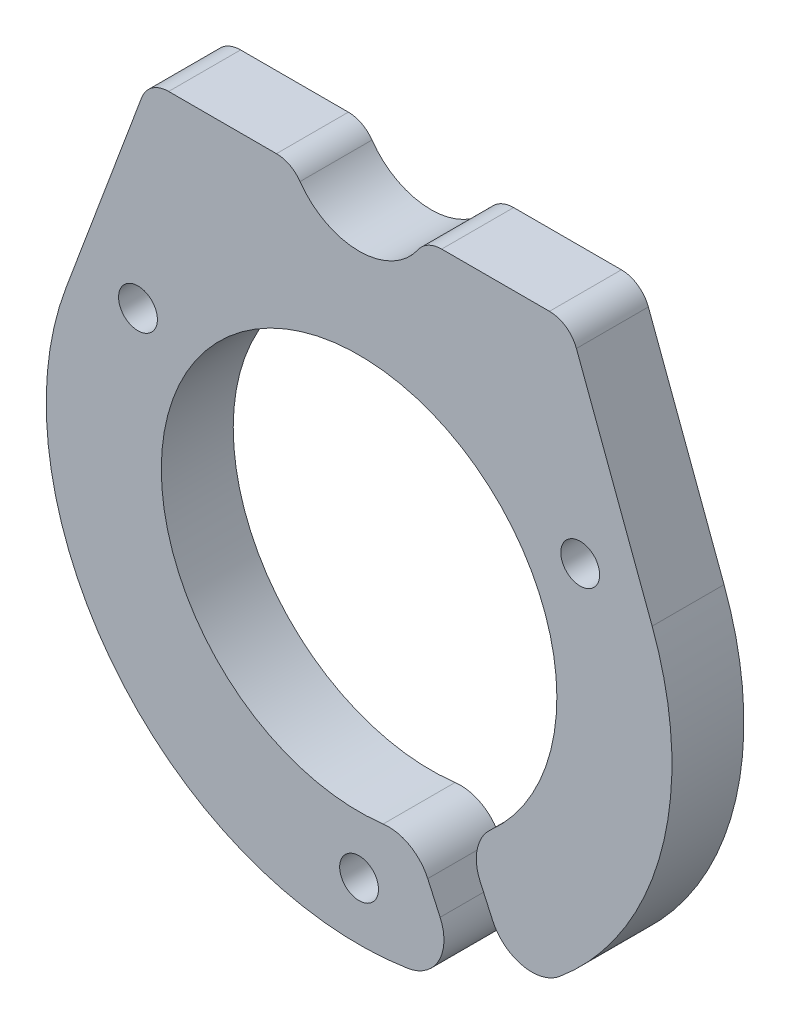
ISO-10303-21;
HEADER;
FILE_DESCRIPTION(('STEP AP214'),'2;1');
FILE_NAME('part.step','',(''),(''),'','','');
FILE_SCHEMA(('AUTOMOTIVE_DESIGN { 1 0 10303 214 1 1 1 1 }'));
ENDSEC;
DATA;
#1=APPLICATION_CONTEXT('core data for automotive mechanical design processes');
#2=APPLICATION_PROTOCOL_DEFINITION('international standard','automotive_design',2000,#1);
#3=PRODUCT_CONTEXT('',#1,'mechanical');
#4=PRODUCT('Part','Part','',(#3));
#5=PRODUCT_RELATED_PRODUCT_CATEGORY('part','',(#4));
#6=PRODUCT_DEFINITION_FORMATION('','',#4);
#7=PRODUCT_DEFINITION_CONTEXT('part definition',#1,'design');
#8=PRODUCT_DEFINITION('design','',#6,#7);
#9=PRODUCT_DEFINITION_SHAPE('','',#8);
#10=(LENGTH_UNIT() NAMED_UNIT(*) SI_UNIT(.MILLI.,.METRE.));
#11=(NAMED_UNIT(*) PLANE_ANGLE_UNIT() SI_UNIT($,.RADIAN.));
#12=(NAMED_UNIT(*) SI_UNIT($,.STERADIAN.) SOLID_ANGLE_UNIT());
#13=UNCERTAINTY_MEASURE_WITH_UNIT(LENGTH_MEASURE(1.E-05),#10,'distance_accuracy_value','');
#14=(GEOMETRIC_REPRESENTATION_CONTEXT(3) GLOBAL_UNCERTAINTY_ASSIGNED_CONTEXT((#13)) GLOBAL_UNIT_ASSIGNED_CONTEXT((#10,
#11,#12)) REPRESENTATION_CONTEXT('',''));
#15=CARTESIAN_POINT('',(0.,0.,0.));
#16=DIRECTION('',(0.,0.,1.));
#17=DIRECTION('',(1.,0.,0.));
#18=AXIS2_PLACEMENT_3D('',#15,#16,#17);
#19=CARTESIAN_POINT('',(0.,0.,4.99999999999997));
#20=DIRECTION('',(0.,0.,-1.));
#21=DIRECTION('',(-1.,0.,0.));
#22=AXIS2_PLACEMENT_3D('',#19,#20,#21);
#23=PLANE('',#22);
#24=DIRECTION('',(1.,0.,0.));
#25=VECTOR('',#24,1.);
#26=CARTESIAN_POINT('',(-21.7499999999999,23.,4.99999999999997));
#27=LINE('',#26,#25);
#28=CARTESIAN_POINT('',(5.74456264653802,23.,4.99999999999997));
#29=VERTEX_POINT('',#28);
#30=CARTESIAN_POINT('',(13.2372607145539,23.,4.99999999999997));
#31=VERTEX_POINT('',#30);
#32=EDGE_CURVE('E296',#29,#31,#27,.T.);
#33=ORIENTED_EDGE('',*,*,#32,.F.);
#34=CARTESIAN_POINT('',(5.74456264653803,21.,4.99999999999997));
#35=DIRECTION('',(0.,0.,-1.));
#36=DIRECTION('',(-1.,0.,0.));
#37=AXIS2_PLACEMENT_3D('',#34,#35,#36);
#38=CIRCLE('',#37,2.);
#39=CARTESIAN_POINT('',(4.10325903324145,22.1428571428571,4.99999999999997));
#40=VERTEX_POINT('',#39);
#41=EDGE_CURVE('E265',#29,#40,#38,.F.);
#42=ORIENTED_EDGE('',*,*,#41,.T.);
#43=CARTESIAN_POINT('',(0.,25.,4.99999999999997));
#44=DIRECTION('',(0.,0.,1.));
#45=DIRECTION('',(1.,0.,0.));
#46=AXIS2_PLACEMENT_3D('',#43,#44,#45);
#47=CIRCLE('',#46,5.);
#48=CARTESIAN_POINT('',(-4.10325903324145,22.1428571428571,4.99999999999997));
#49=VERTEX_POINT('',#48);
#50=EDGE_CURVE('E204',#49,#40,#47,.T.);
#51=ORIENTED_EDGE('',*,*,#50,.F.);
#52=CARTESIAN_POINT('',(-5.74456264653803,21.,4.99999999999997));
#53=DIRECTION('',(0.,0.,-1.));
#54=DIRECTION('',(-1.,0.,0.));
#55=AXIS2_PLACEMENT_3D('',#52,#53,#54);
#56=CIRCLE('',#55,2.);
#57=CARTESIAN_POINT('',(-5.74456264653803,23.,4.99999999999997));
#58=VERTEX_POINT('',#57);
#59=EDGE_CURVE('E263',#49,#58,#56,.F.);
#60=ORIENTED_EDGE('',*,*,#59,.T.);
#61=CARTESIAN_POINT('',(-13.2372607145539,23.,4.99999999999997));
#62=VERTEX_POINT('',#61);
#63=EDGE_CURVE('E286',#62,#58,#27,.T.);
#64=ORIENTED_EDGE('',*,*,#63,.F.);
#65=CARTESIAN_POINT('',(-13.2372607145539,21.,4.99999999999997));
#66=DIRECTION('',(0.,0.,-1.));
#67=DIRECTION('',(-1.,0.,0.));
#68=AXIS2_PLACEMENT_3D('',#65,#66,#67);
#69=CIRCLE('',#68,2.);
#70=CARTESIAN_POINT('',(-15.1107601140734,21.7,4.99999999999997));
#71=VERTEX_POINT('',#70);
#72=EDGE_CURVE('E259',#62,#71,#69,.F.);
#73=ORIENTED_EDGE('',*,*,#72,.T.);
#74=DIRECTION('',(-0.35,-0.93674969975976,0.));
#75=VECTOR('',#74,1.);
#76=CARTESIAN_POINT('',(-20.3743059697748,7.61249999999999,4.99999999999997));
#77=LINE('',#76,#75);
#78=CARTESIAN_POINT('',(-20.3743059697747,7.61249999999996,4.99999999999997));
#79=VERTEX_POINT('',#78);
#80=EDGE_CURVE('E189',#71,#79,#77,.T.);
#81=ORIENTED_EDGE('',*,*,#80,.T.);
#82=CARTESIAN_POINT('',(2.0122792321331E-13,0.,4.99999999999997));
#83=DIRECTION('',(0.,0.,1.));
#84=DIRECTION('',(1.,0.,0.));
#85=AXIS2_PLACEMENT_3D('',#82,#83,#84);
#86=CIRCLE('',#85,21.7500000000001);
#87=CARTESIAN_POINT('',(3.36438085449537,-21.4882163397968,4.99999999999997));
#88=VERTEX_POINT('',#87);
#89=EDGE_CURVE('E191',#79,#88,#86,.T.);
#90=ORIENTED_EDGE('',*,*,#89,.T.);
#91=CARTESIAN_POINT('',(2.90032832284087,-18.5243244308593,4.99999999999997));
#92=DIRECTION('',(0.,0.,-1.));
#93=DIRECTION('',(-1.,0.,0.));
#94=AXIS2_PLACEMENT_3D('',#91,#92,#93);
#95=CIRCLE('',#94,3.);
#96=CARTESIAN_POINT('',(5.63314686556143,-17.2867046134021,4.99999999999997));
#97=VERTEX_POINT('',#96);
#98=EDGE_CURVE('E235',#88,#97,#95,.F.);
#99=ORIENTED_EDGE('',*,*,#98,.T.);
#100=DIRECTION('',(-0.412539939152385,0.910939514240186,0.));
#101=VECTOR('',#100,1.);
#102=CARTESIAN_POINT('',(3.79021853689748,-13.2172895649055,4.99999999999997));
#103=LINE('',#102,#101);
#104=CARTESIAN_POINT('',(4.7731173916648,-15.3876525293947,4.99999999999997));
#105=VERTEX_POINT('',#104);
#106=EDGE_CURVE('E197',#97,#105,#103,.T.);
#107=ORIENTED_EDGE('',*,*,#106,.T.);
#108=CARTESIAN_POINT('',(2.04029884894424,-16.6252723468519,4.99999999999997));
#109=DIRECTION('',(0.,0.,-1.));
#110=DIRECTION('',(-1.,0.,0.));
#111=AXIS2_PLACEMENT_3D('',#108,#109,#110);
#112=CIRCLE('',#111,3.);
#113=CARTESIAN_POINT('',(1.67487218943184,-13.6476116280127,4.99999999999997));
#114=VERTEX_POINT('',#113);
#115=EDGE_CURVE('E239',#105,#114,#112,.F.);
#116=ORIENTED_EDGE('',*,*,#115,.T.);
#117=CARTESIAN_POINT('',(0.,0.,4.99999999999997));
#118=DIRECTION('',(0.,0.,-1.));
#119=DIRECTION('',(-1.,0.,0.));
#120=AXIS2_PLACEMENT_3D('',#117,#118,#119);
#121=CIRCLE('',#120,13.75);
#122=CARTESIAN_POINT('',(9.15273387349307,-10.2610897394484,4.99999999999997));
#123=VERTEX_POINT('',#122);
#124=EDGE_CURVE('E218',#114,#123,#121,.T.);
#125=ORIENTED_EDGE('',*,*,#124,.T.);
#126=CARTESIAN_POINT('',(11.1496939913461,-12.499872955328,4.99999999999997));
#127=DIRECTION('',(0.,0.,-1.));
#128=DIRECTION('',(-1.,0.,0.));
#129=AXIS2_PLACEMENT_3D('',#126,#127,#128);
#130=CIRCLE('',#129,3.);
#131=CARTESIAN_POINT('',(8.41687544862555,-13.7374927727852,4.99999999999997));
#132=VERTEX_POINT('',#131);
#133=EDGE_CURVE('E237',#123,#132,#130,.F.);
#134=ORIENTED_EDGE('',*,*,#133,.T.);
#135=DIRECTION('',(0.412539939152384,-0.910939514240186,0.));
#136=VECTOR('',#135,1.);
#137=CARTESIAN_POINT('',(7.43397659385823,-11.5671298082959,4.99999999999997));
#138=LINE('',#137,#136);
#139=CARTESIAN_POINT('',(9.27690492252214,-15.6365448567925,4.99999999999997));
#140=VERTEX_POINT('',#139);
#141=EDGE_CURVE('E173',#132,#140,#138,.T.);
#142=ORIENTED_EDGE('',*,*,#141,.T.);
#143=CARTESIAN_POINT('',(12.0097234652427,-14.3989250393354,4.99999999999997));
#144=DIRECTION('',(0.,0.,-1.));
#145=DIRECTION('',(-1.,0.,0.));
#146=AXIS2_PLACEMENT_3D('',#143,#144,#145);
#147=CIRCLE('',#146,3.);
#148=CARTESIAN_POINT('',(13.9312792196815,-16.702753045629,4.99999999999997));
#149=VERTEX_POINT('',#148);
#150=EDGE_CURVE('E169',#140,#149,#147,.F.);
#151=ORIENTED_EDGE('',*,*,#150,.T.);
#152=CARTESIAN_POINT('',(0.,0.,4.99999999999997));
#153=DIRECTION('',(0.,0.,1.));
#154=DIRECTION('',(1.,0.,0.));
#155=AXIS2_PLACEMENT_3D('',#152,#153,#154);
#156=CIRCLE('',#155,21.75);
#157=CARTESIAN_POINT('',(20.3743059697748,7.61249999999999,4.99999999999997));
#158=VERTEX_POINT('',#157);
#159=EDGE_CURVE('E161',#149,#158,#156,.T.);
#160=ORIENTED_EDGE('',*,*,#159,.T.);
#161=DIRECTION('',(-0.35,0.93674969975976,0.));
#162=VECTOR('',#161,1.);
#163=CARTESIAN_POINT('',(12.1777460968769,29.55,4.99999999999997));
#164=LINE('',#163,#162);
#165=CARTESIAN_POINT('',(15.1107601140734,21.7,4.99999999999997));
#166=VERTEX_POINT('',#165);
#167=EDGE_CURVE('E166',#158,#166,#164,.T.);
#168=ORIENTED_EDGE('',*,*,#167,.T.);
#169=CARTESIAN_POINT('',(13.2372607145539,21.,4.99999999999997));
#170=DIRECTION('',(0.,0.,-1.));
#171=DIRECTION('',(-1.,0.,0.));
#172=AXIS2_PLACEMENT_3D('',#169,#170,#171);
#173=CIRCLE('',#172,2.);
#174=EDGE_CURVE('E261',#166,#31,#173,.F.);
#175=ORIENTED_EDGE('',*,*,#174,.T.);
#176=EDGE_LOOP('',(#33,#42,#51,#60,#64,#73,#81,#90,#99,#107,#116,#125,#134,#142,#151,#160,#168,#175));
#177=FACE_BOUND('',#176,.T.);
#178=CARTESIAN_POINT('',(0.,-17.75,4.99999999999997));
#179=DIRECTION('',(0.,0.,1.));
#180=DIRECTION('',(1.,0.,0.));
#181=AXIS2_PLACEMENT_3D('',#178,#179,#180);
#182=CIRCLE('',#181,1.35);
#183=CARTESIAN_POINT('',(1.35,-17.75,4.99999999999997));
#184=VERTEX_POINT('',#183);
#185=EDGE_CURVE('E311',#184,#184,#182,.T.);
#186=ORIENTED_EDGE('',*,*,#185,.F.);
#187=EDGE_LOOP('',(#186));
#188=FACE_BOUND('',#187,.T.);
#189=CARTESIAN_POINT('',(15.3719509171737,8.87500000000007,4.99999999999997));
#190=DIRECTION('',(0.,0.,1.));
#191=DIRECTION('',(1.,0.,0.));
#192=AXIS2_PLACEMENT_3D('',#189,#190,#191);
#193=CIRCLE('',#192,1.35);
#194=CARTESIAN_POINT('',(16.7219509171737,8.87500000000007,4.99999999999997));
#195=VERTEX_POINT('',#194);
#196=EDGE_CURVE('E305',#195,#195,#193,.T.);
#197=ORIENTED_EDGE('',*,*,#196,.F.);
#198=EDGE_LOOP('',(#197));
#199=FACE_BOUND('',#198,.T.);
#200=CARTESIAN_POINT('',(-15.3719509171737,8.87500000000007,4.99999999999997));
#201=DIRECTION('',(0.,0.,1.));
#202=DIRECTION('',(1.,0.,0.));
#203=AXIS2_PLACEMENT_3D('',#200,#201,#202);
#204=CIRCLE('',#203,1.35);
#205=CARTESIAN_POINT('',(-14.0219509171737,8.87500000000007,4.99999999999997));
#206=VERTEX_POINT('',#205);
#207=EDGE_CURVE('E299',#206,#206,#204,.T.);
#208=ORIENTED_EDGE('',*,*,#207,.F.);
#209=EDGE_LOOP('',(#208));
#210=FACE_BOUND('',#209,.T.);
#211=ADVANCED_FACE('F34',(#177,#188,#199,#210),#23,.F.);
#212=CARTESIAN_POINT('',(0.,0.,0.));
#213=DIRECTION('',(0.,0.,-1.));
#214=DIRECTION('',(-1.,0.,0.));
#215=AXIS2_PLACEMENT_3D('',#212,#213,#214);
#216=PLANE('',#215);
#217=CARTESIAN_POINT('',(0.,25.,0.));
#218=DIRECTION('',(0.,0.,1.));
#219=DIRECTION('',(1.,0.,0.));
#220=AXIS2_PLACEMENT_3D('',#217,#218,#219);
#221=CIRCLE('',#220,5.);
#222=CARTESIAN_POINT('',(-4.10325903324145,22.1428571428571,0.));
#223=VERTEX_POINT('',#222);
#224=CARTESIAN_POINT('',(4.10325903324145,22.1428571428571,0.));
#225=VERTEX_POINT('',#224);
#226=EDGE_CURVE('E314',#223,#225,#221,.T.);
#227=ORIENTED_EDGE('',*,*,#226,.T.);
#228=CARTESIAN_POINT('',(5.74456264653803,21.,0.));
#229=DIRECTION('',(0.,0.,-1.));
#230=DIRECTION('',(-1.,0.,0.));
#231=AXIS2_PLACEMENT_3D('',#228,#229,#230);
#232=CIRCLE('',#231,2.);
#233=CARTESIAN_POINT('',(5.74456264653802,23.,0.));
#234=VERTEX_POINT('',#233);
#235=EDGE_CURVE('E275',#225,#234,#232,.T.);
#236=ORIENTED_EDGE('',*,*,#235,.T.);
#237=DIRECTION('',(-1.,0.,0.));
#238=VECTOR('',#237,1.);
#239=CARTESIAN_POINT('',(-21.7499999999999,23.,0.));
#240=LINE('',#239,#238);
#241=CARTESIAN_POINT('',(13.2372607145539,23.,0.));
#242=VERTEX_POINT('',#241);
#243=EDGE_CURVE('E292',#242,#234,#240,.T.);
#244=ORIENTED_EDGE('',*,*,#243,.F.);
#245=CARTESIAN_POINT('',(13.2372607145539,21.,0.));
#246=DIRECTION('',(0.,0.,-1.));
#247=DIRECTION('',(-1.,0.,0.));
#248=AXIS2_PLACEMENT_3D('',#245,#246,#247);
#249=CIRCLE('',#248,2.);
#250=CARTESIAN_POINT('',(15.1107601140734,21.7,0.));
#251=VERTEX_POINT('',#250);
#252=EDGE_CURVE('E272',#242,#251,#249,.T.);
#253=ORIENTED_EDGE('',*,*,#252,.T.);
#254=DIRECTION('',(-0.35,0.93674969975976,0.));
#255=VECTOR('',#254,1.);
#256=CARTESIAN_POINT('',(12.1777460968769,29.55,0.));
#257=LINE('',#256,#255);
#258=CARTESIAN_POINT('',(20.3743059697748,7.61249999999999,0.));
#259=VERTEX_POINT('',#258);
#260=EDGE_CURVE('E208',#259,#251,#257,.T.);
#261=ORIENTED_EDGE('',*,*,#260,.F.);
#262=CARTESIAN_POINT('',(0.,0.,0.));
#263=DIRECTION('',(0.,0.,1.));
#264=DIRECTION('',(1.,0.,0.));
#265=AXIS2_PLACEMENT_3D('',#262,#263,#264);
#266=CIRCLE('',#265,21.75);
#267=CARTESIAN_POINT('',(13.9312792196815,-16.702753045629,0.));
#268=VERTEX_POINT('',#267);
#269=EDGE_CURVE('E179',#268,#259,#266,.T.);
#270=ORIENTED_EDGE('',*,*,#269,.F.);
#271=CARTESIAN_POINT('',(12.0097234652427,-14.3989250393354,0.));
#272=DIRECTION('',(0.,0.,-1.));
#273=DIRECTION('',(-1.,0.,0.));
#274=AXIS2_PLACEMENT_3D('',#271,#272,#273);
#275=CIRCLE('',#274,3.);
#276=CARTESIAN_POINT('',(9.27690492252214,-15.6365448567925,0.));
#277=VERTEX_POINT('',#276);
#278=EDGE_CURVE('E228',#268,#277,#275,.T.);
#279=ORIENTED_EDGE('',*,*,#278,.T.);
#280=DIRECTION('',(0.412539939152384,-0.910939514240186,0.));
#281=VECTOR('',#280,1.);
#282=CARTESIAN_POINT('',(7.43397659385823,-11.5671298082959,0.));
#283=LINE('',#282,#281);
#284=CARTESIAN_POINT('',(8.41687544862555,-13.7374927727852,0.));
#285=VERTEX_POINT('',#284);
#286=EDGE_CURVE('E203',#285,#277,#283,.T.);
#287=ORIENTED_EDGE('',*,*,#286,.F.);
#288=CARTESIAN_POINT('',(11.1496939913461,-12.499872955328,0.));
#289=DIRECTION('',(0.,0.,-1.));
#290=DIRECTION('',(-1.,0.,0.));
#291=AXIS2_PLACEMENT_3D('',#288,#289,#290);
#292=CIRCLE('',#291,3.);
#293=CARTESIAN_POINT('',(9.15273387349307,-10.2610897394484,0.));
#294=VERTEX_POINT('',#293);
#295=EDGE_CURVE('E224',#285,#294,#292,.T.);
#296=ORIENTED_EDGE('',*,*,#295,.T.);
#297=CARTESIAN_POINT('',(0.,0.,0.));
#298=DIRECTION('',(0.,0.,-1.));
#299=DIRECTION('',(-1.,0.,0.));
#300=AXIS2_PLACEMENT_3D('',#297,#298,#299);
#301=CIRCLE('',#300,13.75);
#302=CARTESIAN_POINT('',(1.67487218943184,-13.6476116280127,0.));
#303=VERTEX_POINT('',#302);
#304=EDGE_CURVE('E200',#303,#294,#301,.T.);
#305=ORIENTED_EDGE('',*,*,#304,.F.);
#306=CARTESIAN_POINT('',(2.04029884894424,-16.6252723468519,0.));
#307=DIRECTION('',(0.,0.,-1.));
#308=DIRECTION('',(-1.,0.,0.));
#309=AXIS2_PLACEMENT_3D('',#306,#307,#308);
#310=CIRCLE('',#309,3.);
#311=CARTESIAN_POINT('',(4.7731173916648,-15.3876525293947,0.));
#312=VERTEX_POINT('',#311);
#313=EDGE_CURVE('E226',#303,#312,#310,.T.);
#314=ORIENTED_EDGE('',*,*,#313,.T.);
#315=DIRECTION('',(-0.412539939152385,0.910939514240186,0.));
#316=VECTOR('',#315,1.);
#317=CARTESIAN_POINT('',(3.79021853689748,-13.2172895649055,0.));
#318=LINE('',#317,#316);
#319=CARTESIAN_POINT('',(5.63314686556143,-17.2867046134021,0.));
#320=VERTEX_POINT('',#319);
#321=EDGE_CURVE('E215',#320,#312,#318,.T.);
#322=ORIENTED_EDGE('',*,*,#321,.F.);
#323=CARTESIAN_POINT('',(2.90032832284087,-18.5243244308593,0.));
#324=DIRECTION('',(0.,0.,-1.));
#325=DIRECTION('',(-1.,0.,0.));
#326=AXIS2_PLACEMENT_3D('',#323,#324,#325);
#327=CIRCLE('',#326,3.);
#328=CARTESIAN_POINT('',(3.36438085449537,-21.4882163397968,0.));
#329=VERTEX_POINT('',#328);
#330=EDGE_CURVE('E222',#320,#329,#327,.T.);
#331=ORIENTED_EDGE('',*,*,#330,.T.);
#332=CARTESIAN_POINT('',(2.0122792321331E-13,0.,0.));
#333=DIRECTION('',(0.,0.,1.));
#334=DIRECTION('',(1.,0.,0.));
#335=AXIS2_PLACEMENT_3D('',#332,#333,#334);
#336=CIRCLE('',#335,21.7500000000001);
#337=CARTESIAN_POINT('',(-20.3743059697747,7.61249999999996,0.));
#338=VERTEX_POINT('',#337);
#339=EDGE_CURVE('E212',#338,#329,#336,.T.);
#340=ORIENTED_EDGE('',*,*,#339,.F.);
#341=DIRECTION('',(-0.35,-0.93674969975976,0.));
#342=VECTOR('',#341,1.);
#343=CARTESIAN_POINT('',(-20.3743059697748,7.61249999999999,0.));
#344=LINE('',#343,#342);
#345=CARTESIAN_POINT('',(-15.1107601140734,21.7,0.));
#346=VERTEX_POINT('',#345);
#347=EDGE_CURVE('E210',#346,#338,#344,.T.);
#348=ORIENTED_EDGE('',*,*,#347,.F.);
#349=CARTESIAN_POINT('',(-13.2372607145539,21.,0.));
#350=DIRECTION('',(0.,0.,-1.));
#351=DIRECTION('',(-1.,0.,0.));
#352=AXIS2_PLACEMENT_3D('',#349,#350,#351);
#353=CIRCLE('',#352,2.);
#354=CARTESIAN_POINT('',(-13.2372607145539,23.,0.));
#355=VERTEX_POINT('',#354);
#356=EDGE_CURVE('E49',#346,#355,#353,.T.);
#357=ORIENTED_EDGE('',*,*,#356,.T.);
#358=CARTESIAN_POINT('',(-5.74456264653803,23.,0.));
#359=VERTEX_POINT('',#358);
#360=EDGE_CURVE('E283',#359,#355,#240,.T.);
#361=ORIENTED_EDGE('',*,*,#360,.F.);
#362=CARTESIAN_POINT('',(-5.74456264653803,21.,0.));
#363=DIRECTION('',(0.,0.,-1.));
#364=DIRECTION('',(-1.,0.,0.));
#365=AXIS2_PLACEMENT_3D('',#362,#363,#364);
#366=CIRCLE('',#365,2.);
#367=EDGE_CURVE('E57',#359,#223,#366,.T.);
#368=ORIENTED_EDGE('',*,*,#367,.T.);
#369=EDGE_LOOP('',(#227,#236,#244,#253,#261,#270,#279,#287,#296,#305,#314,#322,#331,#340,#348,
#357,#361,#368));
#370=FACE_BOUND('',#369,.T.);
#371=CARTESIAN_POINT('',(15.3719509171737,8.87500000000007,0.));
#372=DIRECTION('',(0.,0.,1.));
#373=DIRECTION('',(1.,0.,0.));
#374=AXIS2_PLACEMENT_3D('',#371,#372,#373);
#375=CIRCLE('',#374,1.35);
#376=CARTESIAN_POINT('',(16.7219509171737,8.87500000000007,0.));
#377=VERTEX_POINT('',#376);
#378=EDGE_CURVE('E302',#377,#377,#375,.T.);
#379=ORIENTED_EDGE('',*,*,#378,.T.);
#380=EDGE_LOOP('',(#379));
#381=FACE_BOUND('',#380,.T.);
#382=CARTESIAN_POINT('',(0.,-17.75,0.));
#383=DIRECTION('',(0.,0.,1.));
#384=DIRECTION('',(1.,0.,0.));
#385=AXIS2_PLACEMENT_3D('',#382,#383,#384);
#386=CIRCLE('',#385,1.35);
#387=CARTESIAN_POINT('',(1.35,-17.75,0.));
#388=VERTEX_POINT('',#387);
#389=EDGE_CURVE('E308',#388,#388,#386,.T.);
#390=ORIENTED_EDGE('',*,*,#389,.T.);
#391=EDGE_LOOP('',(#390));
#392=FACE_BOUND('',#391,.T.);
#393=CARTESIAN_POINT('',(-15.3719509171737,8.87500000000007,0.));
#394=DIRECTION('',(0.,0.,1.));
#395=DIRECTION('',(1.,0.,0.));
#396=AXIS2_PLACEMENT_3D('',#393,#394,#395);
#397=CIRCLE('',#396,1.35);
#398=CARTESIAN_POINT('',(-14.0219509171737,8.87500000000007,0.));
#399=VERTEX_POINT('',#398);
#400=EDGE_CURVE('E295',#399,#399,#397,.T.);
#401=ORIENTED_EDGE('',*,*,#400,.T.);
#402=EDGE_LOOP('',(#401));
#403=FACE_BOUND('',#402,.T.);
#404=ADVANCED_FACE('F289',(#370,#381,#392,#403),#216,.T.);
#405=CARTESIAN_POINT('',(0.,0.,4.99999999999997));
#406=DIRECTION('',(0.,0.,-1.));
#407=DIRECTION('',(-1.,0.,0.));
#408=AXIS2_PLACEMENT_3D('',#405,#406,#407);
#409=CYLINDRICAL_SURFACE('',#408,13.75);
#410=ORIENTED_EDGE('',*,*,#124,.F.);
#411=DIRECTION('',(0.,0.,-1.));
#412=VECTOR('',#411,1.);
#413=CARTESIAN_POINT('',(1.67487218943184,-13.6476116280127,4.99999999999997));
#414=LINE('',#413,#412);
#415=EDGE_CURVE('E244',#114,#303,#414,.T.);
#416=ORIENTED_EDGE('',*,*,#415,.T.);
#417=ORIENTED_EDGE('',*,*,#304,.T.);
#418=DIRECTION('',(0.,0.,-1.));
#419=VECTOR('',#418,1.);
#420=CARTESIAN_POINT('',(9.15273387349307,-10.2610897394484,4.99999999999997));
#421=LINE('',#420,#419);
#422=EDGE_CURVE('E242',#294,#123,#421,.F.);
#423=ORIENTED_EDGE('',*,*,#422,.T.);
#424=EDGE_LOOP('',(#410,#416,#417,#423));
#425=FACE_BOUND('',#424,.T.);
#426=ADVANCED_FACE('F373',(#425),#409,.F.);
#427=CARTESIAN_POINT('',(7.43397659385823,-11.5671298082959,4.99999999999997));
#428=DIRECTION('',(0.910939514240187,0.412539939152384,0.));
#429=DIRECTION('',(-0.412539939152384,0.910939514240187,0.));
#430=AXIS2_PLACEMENT_3D('',#427,#428,#429);
#431=PLANE('',#430);
#432=ORIENTED_EDGE('',*,*,#286,.T.);
#433=DIRECTION('',(0.,0.,-1.));
#434=VECTOR('',#433,1.);
#435=CARTESIAN_POINT('',(9.27690492252214,-15.6365448567925,4.99999999999997));
#436=LINE('',#435,#434);
#437=EDGE_CURVE('E233',#277,#140,#436,.F.);
#438=ORIENTED_EDGE('',*,*,#437,.T.);
#439=ORIENTED_EDGE('',*,*,#141,.F.);
#440=DIRECTION('',(0.,0.,-1.));
#441=VECTOR('',#440,1.);
#442=CARTESIAN_POINT('',(8.41687544862555,-13.7374927727852,4.99999999999997));
#443=LINE('',#442,#441);
#444=EDGE_CURVE('E230',#132,#285,#443,.T.);
#445=ORIENTED_EDGE('',*,*,#444,.T.);
#446=EDGE_LOOP('',(#432,#438,#439,#445));
#447=FACE_BOUND('',#446,.T.);
#448=ADVANCED_FACE('F378',(#447),#431,.F.);
#449=CARTESIAN_POINT('',(0.,0.,4.99999999999997));
#450=DIRECTION('',(0.,0.,-1.));
#451=DIRECTION('',(-1.,0.,0.));
#452=AXIS2_PLACEMENT_3D('',#449,#450,#451);
#453=CYLINDRICAL_SURFACE('',#452,21.75);
#454=ORIENTED_EDGE('',*,*,#159,.F.);
#455=DIRECTION('',(0.,0.,-1.));
#456=VECTOR('',#455,1.);
#457=CARTESIAN_POINT('',(13.9312792196815,-16.702753045629,4.99999999999997));
#458=LINE('',#457,#456);
#459=EDGE_CURVE('E183',#149,#268,#458,.T.);
#460=ORIENTED_EDGE('',*,*,#459,.T.);
#461=ORIENTED_EDGE('',*,*,#269,.T.);
#462=DIRECTION('',(0.,0.,-1.));
#463=VECTOR('',#462,1.);
#464=CARTESIAN_POINT('',(20.3743059697748,7.61249999999999,4.99999999999997));
#465=LINE('',#464,#463);
#466=EDGE_CURVE('E176',#158,#259,#465,.T.);
#467=ORIENTED_EDGE('',*,*,#466,.F.);
#468=EDGE_LOOP('',(#454,#460,#461,#467));
#469=FACE_BOUND('',#468,.T.);
#470=ADVANCED_FACE('F177',(#469),#453,.T.);
#471=CARTESIAN_POINT('',(12.1777460968769,29.55,4.99999999999997));
#472=DIRECTION('',(-0.93674969975976,-0.35,0.));
#473=DIRECTION('',(0.35,-0.93674969975976,0.));
#474=AXIS2_PLACEMENT_3D('',#471,#472,#473);
#475=PLANE('',#474);
#476=ORIENTED_EDGE('',*,*,#260,.T.);
#477=DIRECTION('',(0.,0.,1.));
#478=VECTOR('',#477,1.);
#479=CARTESIAN_POINT('',(15.1107601140734,21.7,4.99999999999997));
#480=LINE('',#479,#478);
#481=EDGE_CURVE('E42',#251,#166,#480,.T.);
#482=ORIENTED_EDGE('',*,*,#481,.T.);
#483=ORIENTED_EDGE('',*,*,#167,.F.);
#484=ORIENTED_EDGE('',*,*,#466,.T.);
#485=EDGE_LOOP('',(#476,#482,#483,#484));
#486=FACE_BOUND('',#485,.T.);
#487=ADVANCED_FACE('F187',(#486),#475,.F.);
#488=CARTESIAN_POINT('',(-20.3743059697748,7.61249999999999,4.99999999999997));
#489=DIRECTION('',(0.93674969975976,-0.35,0.));
#490=DIRECTION('',(0.35,0.93674969975976,0.));
#491=AXIS2_PLACEMENT_3D('',#488,#489,#490);
#492=PLANE('',#491);
#493=ORIENTED_EDGE('',*,*,#80,.F.);
#494=DIRECTION('',(0.,0.,-1.));
#495=VECTOR('',#494,1.);
#496=CARTESIAN_POINT('',(-15.1107601140734,21.7,4.99999999999997));
#497=LINE('',#496,#495);
#498=EDGE_CURVE('E11',#71,#346,#497,.T.);
#499=ORIENTED_EDGE('',*,*,#498,.T.);
#500=ORIENTED_EDGE('',*,*,#347,.T.);
#501=DIRECTION('',(0.,0.,-1.));
#502=VECTOR('',#501,1.);
#503=CARTESIAN_POINT('',(-20.3743059697747,7.61249999999996,4.99999999999997));
#504=LINE('',#503,#502);
#505=EDGE_CURVE('E184',#79,#338,#504,.T.);
#506=ORIENTED_EDGE('',*,*,#505,.F.);
#507=EDGE_LOOP('',(#493,#499,#500,#506));
#508=FACE_BOUND('',#507,.T.);
#509=ADVANCED_FACE('F351',(#508),#492,.F.);
#510=CARTESIAN_POINT('',(2.0122792321331E-13,0.,4.99999999999997));
#511=DIRECTION('',(0.,0.,-1.));
#512=DIRECTION('',(-1.,0.,0.));
#513=AXIS2_PLACEMENT_3D('',#510,#511,#512);
#514=CYLINDRICAL_SURFACE('',#513,21.7500000000001);
#515=ORIENTED_EDGE('',*,*,#339,.T.);
#516=DIRECTION('',(0.,0.,-1.));
#517=VECTOR('',#516,1.);
#518=CARTESIAN_POINT('',(3.36438085449537,-21.4882163397968,4.99999999999997));
#519=LINE('',#518,#517);
#520=EDGE_CURVE('E252',#329,#88,#519,.F.);
#521=ORIENTED_EDGE('',*,*,#520,.T.);
#522=ORIENTED_EDGE('',*,*,#89,.F.);
#523=ORIENTED_EDGE('',*,*,#505,.T.);
#524=EDGE_LOOP('',(#515,#521,#522,#523));
#525=FACE_BOUND('',#524,.T.);
#526=ADVANCED_FACE('F357',(#525),#514,.T.);
#527=CARTESIAN_POINT('',(3.79021853689748,-13.2172895649055,4.99999999999997));
#528=DIRECTION('',(-0.910939514240187,-0.412539939152385,0.));
#529=DIRECTION('',(0.412539939152385,-0.910939514240187,0.));
#530=AXIS2_PLACEMENT_3D('',#527,#528,#529);
#531=PLANE('',#530);
#532=ORIENTED_EDGE('',*,*,#321,.T.);
#533=DIRECTION('',(0.,0.,-1.));
#534=VECTOR('',#533,1.);
#535=CARTESIAN_POINT('',(4.7731173916648,-15.3876525293947,4.99999999999997));
#536=LINE('',#535,#534);
#537=EDGE_CURVE('E250',#312,#105,#536,.F.);
#538=ORIENTED_EDGE('',*,*,#537,.T.);
#539=ORIENTED_EDGE('',*,*,#106,.F.);
#540=DIRECTION('',(0.,0.,-1.));
#541=VECTOR('',#540,1.);
#542=CARTESIAN_POINT('',(5.63314686556143,-17.2867046134021,4.99999999999997));
#543=LINE('',#542,#541);
#544=EDGE_CURVE('E247',#97,#320,#543,.T.);
#545=ORIENTED_EDGE('',*,*,#544,.T.);
#546=EDGE_LOOP('',(#532,#538,#539,#545));
#547=FACE_BOUND('',#546,.T.);
#548=ADVANCED_FACE('F366',(#547),#531,.F.);
#549=CARTESIAN_POINT('',(0.,25.,4.99999999999997));
#550=DIRECTION('',(0.,0.,-1.));
#551=DIRECTION('',(-1.,0.,0.));
#552=AXIS2_PLACEMENT_3D('',#549,#550,#551);
#553=CYLINDRICAL_SURFACE('',#552,5.);
#554=ORIENTED_EDGE('',*,*,#50,.T.);
#555=DIRECTION('',(0.,0.,-1.));
#556=VECTOR('',#555,1.);
#557=CARTESIAN_POINT('',(4.10325903324145,22.1428571428571,4.99999999999997));
#558=LINE('',#557,#556);
#559=EDGE_CURVE('E269',#40,#225,#558,.T.);
#560=ORIENTED_EDGE('',*,*,#559,.T.);
#561=ORIENTED_EDGE('',*,*,#226,.F.);
#562=DIRECTION('',(0.,0.,-1.));
#563=VECTOR('',#562,1.);
#564=CARTESIAN_POINT('',(-4.10325903324145,22.1428571428571,4.99999999999997));
#565=LINE('',#564,#563);
#566=EDGE_CURVE('E267',#223,#49,#565,.F.);
#567=ORIENTED_EDGE('',*,*,#566,.T.);
#568=EDGE_LOOP('',(#554,#560,#561,#567));
#569=FACE_BOUND('',#568,.T.);
#570=ADVANCED_FACE('F344',(#569),#553,.F.);
#571=CARTESIAN_POINT('',(0.,-17.75,4.99999999999997));
#572=DIRECTION('',(0.,0.,-1.));
#573=DIRECTION('',(-1.,0.,0.));
#574=AXIS2_PLACEMENT_3D('',#571,#572,#573);
#575=CYLINDRICAL_SURFACE('',#574,1.35);
#576=ORIENTED_EDGE('',*,*,#185,.T.);
#577=EDGE_LOOP('',(#576));
#578=FACE_BOUND('',#577,.T.);
#579=ORIENTED_EDGE('',*,*,#389,.F.);
#580=EDGE_LOOP('',(#579));
#581=FACE_BOUND('',#580,.T.);
#582=ADVANCED_FACE('F427',(#578,#581),#575,.F.);
#583=CARTESIAN_POINT('',(15.3719509171737,8.87500000000007,4.99999999999997));
#584=DIRECTION('',(0.,0.,-1.));
#585=DIRECTION('',(-1.,0.,0.));
#586=AXIS2_PLACEMENT_3D('',#583,#584,#585);
#587=CYLINDRICAL_SURFACE('',#586,1.35);
#588=ORIENTED_EDGE('',*,*,#196,.T.);
#589=EDGE_LOOP('',(#588));
#590=FACE_BOUND('',#589,.T.);
#591=ORIENTED_EDGE('',*,*,#378,.F.);
#592=EDGE_LOOP('',(#591));
#593=FACE_BOUND('',#592,.T.);
#594=ADVANCED_FACE('F433',(#590,#593),#587,.F.);
#595=CARTESIAN_POINT('',(-15.3719509171737,8.87500000000007,4.99999999999997));
#596=DIRECTION('',(0.,0.,-1.));
#597=DIRECTION('',(-1.,0.,0.));
#598=AXIS2_PLACEMENT_3D('',#595,#596,#597);
#599=CYLINDRICAL_SURFACE('',#598,1.35);
#600=ORIENTED_EDGE('',*,*,#207,.T.);
#601=EDGE_LOOP('',(#600));
#602=FACE_BOUND('',#601,.T.);
#603=ORIENTED_EDGE('',*,*,#400,.F.);
#604=EDGE_LOOP('',(#603));
#605=FACE_BOUND('',#604,.T.);
#606=ADVANCED_FACE('F440',(#602,#605),#599,.F.);
#607=CARTESIAN_POINT('',(12.0097234652427,-14.3989250393354,4.99999999999997));
#608=DIRECTION('',(0.,0.,-1.));
#609=DIRECTION('',(-1.,0.,0.));
#610=AXIS2_PLACEMENT_3D('',#607,#608,#609);
#611=CYLINDRICAL_SURFACE('',#610,3.);
#612=ORIENTED_EDGE('',*,*,#150,.F.);
#613=ORIENTED_EDGE('',*,*,#437,.F.);
#614=ORIENTED_EDGE('',*,*,#278,.F.);
#615=ORIENTED_EDGE('',*,*,#459,.F.);
#616=EDGE_LOOP('',(#612,#613,#614,#615));
#617=FACE_BOUND('',#616,.T.);
#618=ADVANCED_FACE('F327',(#617),#611,.T.);
#619=CARTESIAN_POINT('',(2.04029884894424,-16.6252723468519,4.99999999999997));
#620=DIRECTION('',(0.,0.,-1.));
#621=DIRECTION('',(-1.,0.,0.));
#622=AXIS2_PLACEMENT_3D('',#619,#620,#621);
#623=CYLINDRICAL_SURFACE('',#622,3.);
#624=ORIENTED_EDGE('',*,*,#115,.F.);
#625=ORIENTED_EDGE('',*,*,#537,.F.);
#626=ORIENTED_EDGE('',*,*,#313,.F.);
#627=ORIENTED_EDGE('',*,*,#415,.F.);
#628=EDGE_LOOP('',(#624,#625,#626,#627));
#629=FACE_BOUND('',#628,.T.);
#630=ADVANCED_FACE('F369',(#629),#623,.T.);
#631=CARTESIAN_POINT('',(11.1496939913461,-12.499872955328,4.99999999999997));
#632=DIRECTION('',(0.,0.,-1.));
#633=DIRECTION('',(-1.,0.,0.));
#634=AXIS2_PLACEMENT_3D('',#631,#632,#633);
#635=CYLINDRICAL_SURFACE('',#634,3.);
#636=ORIENTED_EDGE('',*,*,#133,.F.);
#637=ORIENTED_EDGE('',*,*,#422,.F.);
#638=ORIENTED_EDGE('',*,*,#295,.F.);
#639=ORIENTED_EDGE('',*,*,#444,.F.);
#640=EDGE_LOOP('',(#636,#637,#638,#639));
#641=FACE_BOUND('',#640,.T.);
#642=ADVANCED_FACE('F377',(#641),#635,.T.);
#643=CARTESIAN_POINT('',(2.90032832284087,-18.5243244308593,4.99999999999997));
#644=DIRECTION('',(0.,0.,-1.));
#645=DIRECTION('',(-1.,0.,0.));
#646=AXIS2_PLACEMENT_3D('',#643,#644,#645);
#647=CYLINDRICAL_SURFACE('',#646,3.);
#648=ORIENTED_EDGE('',*,*,#98,.F.);
#649=ORIENTED_EDGE('',*,*,#520,.F.);
#650=ORIENTED_EDGE('',*,*,#330,.F.);
#651=ORIENTED_EDGE('',*,*,#544,.F.);
#652=EDGE_LOOP('',(#648,#649,#650,#651));
#653=FACE_BOUND('',#652,.T.);
#654=ADVANCED_FACE('F361',(#653),#647,.T.);
#655=CARTESIAN_POINT('',(0.,23.,0.));
#656=DIRECTION('',(0.,-1.,0.));
#657=DIRECTION('',(0.,0.,-1.));
#658=AXIS2_PLACEMENT_3D('',#655,#656,#657);
#659=PLANE('',#658);
#660=ORIENTED_EDGE('',*,*,#243,.T.);
#661=DIRECTION('',(0.,0.,1.));
#662=VECTOR('',#661,1.);
#663=CARTESIAN_POINT('',(5.74456264653803,23.,4.99999999999997));
#664=LINE('',#663,#662);
#665=EDGE_CURVE('E256',#234,#29,#664,.T.);
#666=ORIENTED_EDGE('',*,*,#665,.T.);
#667=ORIENTED_EDGE('',*,*,#32,.T.);
#668=DIRECTION('',(0.,0.,1.));
#669=VECTOR('',#668,1.);
#670=CARTESIAN_POINT('',(13.2372607145539,23.,0.));
#671=LINE('',#670,#669);
#672=EDGE_CURVE('E254',#31,#242,#671,.F.);
#673=ORIENTED_EDGE('',*,*,#672,.T.);
#674=EDGE_LOOP('',(#660,#666,#667,#673));
#675=FACE_BOUND('',#674,.T.);
#676=ADVANCED_FACE('F336',(#675),#659,.F.);
#677=ORIENTED_EDGE('',*,*,#63,.T.);
#678=DIRECTION('',(0.,0.,1.));
#679=VECTOR('',#678,1.);
#680=CARTESIAN_POINT('',(-5.74456264653803,23.,0.));
#681=LINE('',#680,#679);
#682=EDGE_CURVE('E279',#58,#359,#681,.F.);
#683=ORIENTED_EDGE('',*,*,#682,.T.);
#684=ORIENTED_EDGE('',*,*,#360,.T.);
#685=DIRECTION('',(0.,0.,-1.));
#686=VECTOR('',#685,1.);
#687=CARTESIAN_POINT('',(-13.2372607145539,23.,0.));
#688=LINE('',#687,#686);
#689=EDGE_CURVE('E277',#355,#62,#688,.F.);
#690=ORIENTED_EDGE('',*,*,#689,.T.);
#691=EDGE_LOOP('',(#677,#683,#684,#690));
#692=FACE_BOUND('',#691,.T.);
#693=ADVANCED_FACE('F282',(#692),#659,.F.);
#694=CARTESIAN_POINT('',(5.74456264653803,21.,4.99999999999997));
#695=DIRECTION('',(0.,0.,-1.));
#696=DIRECTION('',(-1.,0.,0.));
#697=AXIS2_PLACEMENT_3D('',#694,#695,#696);
#698=CYLINDRICAL_SURFACE('',#697,2.);
#699=ORIENTED_EDGE('',*,*,#235,.F.);
#700=ORIENTED_EDGE('',*,*,#559,.F.);
#701=ORIENTED_EDGE('',*,*,#41,.F.);
#702=ORIENTED_EDGE('',*,*,#665,.F.);
#703=EDGE_LOOP('',(#699,#700,#701,#702));
#704=FACE_BOUND('',#703,.T.);
#705=ADVANCED_FACE('F340',(#704),#698,.T.);
#706=CARTESIAN_POINT('',(-5.74456264653803,21.,4.99999999999997));
#707=DIRECTION('',(0.,0.,-1.));
#708=DIRECTION('',(-1.,0.,0.));
#709=AXIS2_PLACEMENT_3D('',#706,#707,#708);
#710=CYLINDRICAL_SURFACE('',#709,2.);
#711=ORIENTED_EDGE('',*,*,#59,.F.);
#712=ORIENTED_EDGE('',*,*,#566,.F.);
#713=ORIENTED_EDGE('',*,*,#367,.F.);
#714=ORIENTED_EDGE('',*,*,#682,.F.);
#715=EDGE_LOOP('',(#711,#712,#713,#714));
#716=FACE_BOUND('',#715,.T.);
#717=ADVANCED_FACE('F345',(#716),#710,.T.);
#718=CARTESIAN_POINT('',(13.2372607145539,21.,4.99999999999997));
#719=DIRECTION('',(0.,0.,1.));
#720=DIRECTION('',(1.,0.,0.));
#721=AXIS2_PLACEMENT_3D('',#718,#719,#720);
#722=CYLINDRICAL_SURFACE('',#721,2.);
#723=ORIENTED_EDGE('',*,*,#252,.F.);
#724=ORIENTED_EDGE('',*,*,#672,.F.);
#725=ORIENTED_EDGE('',*,*,#174,.F.);
#726=ORIENTED_EDGE('',*,*,#481,.F.);
#727=EDGE_LOOP('',(#723,#724,#725,#726));
#728=FACE_BOUND('',#727,.T.);
#729=ADVANCED_FACE('F332',(#728),#722,.T.);
#730=CARTESIAN_POINT('',(-13.2372607145539,21.,4.99999999999997));
#731=DIRECTION('',(0.,0.,-1.));
#732=DIRECTION('',(-1.,0.,0.));
#733=AXIS2_PLACEMENT_3D('',#730,#731,#732);
#734=CYLINDRICAL_SURFACE('',#733,2.);
#735=ORIENTED_EDGE('',*,*,#72,.F.);
#736=ORIENTED_EDGE('',*,*,#689,.F.);
#737=ORIENTED_EDGE('',*,*,#356,.F.);
#738=ORIENTED_EDGE('',*,*,#498,.F.);
#739=EDGE_LOOP('',(#735,#736,#737,#738));
#740=FACE_BOUND('',#739,.T.);
#741=ADVANCED_FACE('F36',(#740),#734,.T.);
#742=CLOSED_SHELL('',(#211,#404,#426,#448,#470,#487,#509,#526,#548,#570,#582,#594,#606,#618,
#630,#642,#654,#676,#693,#705,#717,#729,#741));
#743=MANIFOLD_SOLID_BREP('B2',#742);
#744=ADVANCED_BREP_SHAPE_REPRESENTATION('',(#18,#743),#14);
#745=SHAPE_DEFINITION_REPRESENTATION(#9,#744);
ENDSEC;
END-ISO-10303-21;
